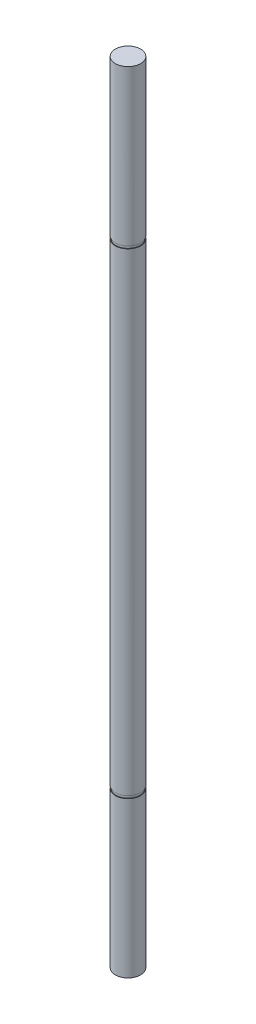
ISO-10303-21;
HEADER;
FILE_DESCRIPTION(('STEP AP214'),'2;1');
FILE_NAME('part.step','',(''),(''),'','','');
FILE_SCHEMA(('AUTOMOTIVE_DESIGN { 1 0 10303 214 1 1 1 1 }'));
ENDSEC;
DATA;
#1=APPLICATION_CONTEXT('core data for automotive mechanical design processes');
#2=APPLICATION_PROTOCOL_DEFINITION('international standard','automotive_design',2000,#1);
#3=PRODUCT_CONTEXT('',#1,'mechanical');
#4=PRODUCT('Part','Part','',(#3));
#5=PRODUCT_RELATED_PRODUCT_CATEGORY('part','',(#4));
#6=PRODUCT_DEFINITION_FORMATION('','',#4);
#7=PRODUCT_DEFINITION_CONTEXT('part definition',#1,'design');
#8=PRODUCT_DEFINITION('design','',#6,#7);
#9=PRODUCT_DEFINITION_SHAPE('','',#8);
#10=(LENGTH_UNIT() NAMED_UNIT(*) SI_UNIT(.MILLI.,.METRE.));
#11=(NAMED_UNIT(*) PLANE_ANGLE_UNIT() SI_UNIT($,.RADIAN.));
#12=(NAMED_UNIT(*) SI_UNIT($,.STERADIAN.) SOLID_ANGLE_UNIT());
#13=UNCERTAINTY_MEASURE_WITH_UNIT(LENGTH_MEASURE(1.E-05),#10,'distance_accuracy_value','');
#14=(GEOMETRIC_REPRESENTATION_CONTEXT(3) GLOBAL_UNCERTAINTY_ASSIGNED_CONTEXT((#13)) GLOBAL_UNIT_ASSIGNED_CONTEXT((#10,
#11,#12)) REPRESENTATION_CONTEXT('',''));
#15=CARTESIAN_POINT('',(0.,0.,0.));
#16=DIRECTION('',(0.,0.,1.));
#17=DIRECTION('',(1.,0.,0.));
#18=AXIS2_PLACEMENT_3D('',#15,#16,#17);
#19=CARTESIAN_POINT('',(0.,125.,0.));
#20=DIRECTION('',(0.,-1.,0.));
#21=DIRECTION('',(0.,0.,-1.));
#22=AXIS2_PLACEMENT_3D('',#19,#20,#21);
#23=CYLINDRICAL_SURFACE('',#22,4.);
#24=CARTESIAN_POINT('',(0.,75.,0.));
#25=DIRECTION('',(0.,1.,0.));
#26=DIRECTION('',(0.,0.,1.));
#27=AXIS2_PLACEMENT_3D('',#24,#25,#26);
#28=CIRCLE('',#27,4.);
#29=CARTESIAN_POINT('',(0.,75.,4.));
#30=VERTEX_POINT('',#29);
#31=EDGE_CURVE('E52',#30,#30,#28,.T.);
#32=ORIENTED_EDGE('',*,*,#31,.F.);
#33=EDGE_LOOP('',(#32));
#34=FACE_BOUND('',#33,.T.);
#35=CARTESIAN_POINT('',(0.,-75.,0.));
#36=DIRECTION('',(0.,-1.,0.));
#37=DIRECTION('',(0.,0.,-1.));
#38=AXIS2_PLACEMENT_3D('',#35,#36,#37);
#39=CIRCLE('',#38,4.);
#40=CARTESIAN_POINT('',(0.,-75.,-4.));
#41=VERTEX_POINT('',#40);
#42=EDGE_CURVE('E56',#41,#41,#39,.T.);
#43=ORIENTED_EDGE('',*,*,#42,.F.);
#44=EDGE_LOOP('',(#43));
#45=FACE_BOUND('',#44,.T.);
#46=ADVANCED_FACE('F33',(#34,#45),#23,.T.);
#47=CARTESIAN_POINT('',(0.,125.,0.));
#48=DIRECTION('',(0.,1.,0.));
#49=DIRECTION('',(0.,0.,1.));
#50=AXIS2_PLACEMENT_3D('',#47,#48,#49);
#51=CIRCLE('',#50,4.);
#52=CARTESIAN_POINT('',(0.,125.,4.));
#53=VERTEX_POINT('',#52);
#54=EDGE_CURVE('E10',#53,#53,#51,.T.);
#55=ORIENTED_EDGE('',*,*,#54,.F.);
#56=EDGE_LOOP('',(#55));
#57=FACE_BOUND('',#56,.T.);
#58=CARTESIAN_POINT('',(0.,75.8,0.));
#59=DIRECTION('',(0.,-1.,0.));
#60=DIRECTION('',(0.,0.,-1.));
#61=AXIS2_PLACEMENT_3D('',#58,#59,#60);
#62=CIRCLE('',#61,4.);
#63=CARTESIAN_POINT('',(0.,75.8,-4.));
#64=VERTEX_POINT('',#63);
#65=EDGE_CURVE('E46',#64,#64,#62,.T.);
#66=ORIENTED_EDGE('',*,*,#65,.F.);
#67=EDGE_LOOP('',(#66));
#68=FACE_BOUND('',#67,.T.);
#69=ADVANCED_FACE('F35',(#57,#68),#23,.T.);
#70=CARTESIAN_POINT('',(0.,125.,0.));
#71=DIRECTION('',(0.,1.,0.));
#72=DIRECTION('',(0.,0.,1.));
#73=AXIS2_PLACEMENT_3D('',#70,#71,#72);
#74=PLANE('',#73);
#75=ORIENTED_EDGE('',*,*,#54,.T.);
#76=EDGE_LOOP('',(#75));
#77=FACE_BOUND('',#76,.T.);
#78=ADVANCED_FACE('F100',(#77),#74,.T.);
#79=CARTESIAN_POINT('',(0.,75.8,-3.79999999999999));
#80=DIRECTION('',(0.,-1.,0.));
#81=DIRECTION('',(0.,0.,-1.));
#82=AXIS2_PLACEMENT_3D('',#79,#80,#81);
#83=PLANE('',#82);
#84=CARTESIAN_POINT('',(0.,75.8,0.));
#85=DIRECTION('',(0.,1.,0.));
#86=DIRECTION('',(0.,0.,1.));
#87=AXIS2_PLACEMENT_3D('',#84,#85,#86);
#88=CIRCLE('',#87,3.79999999999999);
#89=CARTESIAN_POINT('',(0.,75.8,3.79999999999999));
#90=VERTEX_POINT('',#89);
#91=EDGE_CURVE('E49',#90,#90,#88,.T.);
#92=ORIENTED_EDGE('',*,*,#91,.T.);
#93=EDGE_LOOP('',(#92));
#94=FACE_BOUND('',#93,.T.);
#95=ORIENTED_EDGE('',*,*,#65,.T.);
#96=EDGE_LOOP('',(#95));
#97=FACE_BOUND('',#96,.T.);
#98=ADVANCED_FACE('F76',(#94,#97),#83,.T.);
#99=CARTESIAN_POINT('',(0.,75.,-3.79999999999999));
#100=DIRECTION('',(0.,1.,0.));
#101=DIRECTION('',(0.,0.,1.));
#102=AXIS2_PLACEMENT_3D('',#99,#100,#101);
#103=PLANE('',#102);
#104=CARTESIAN_POINT('',(0.,75.,0.));
#105=DIRECTION('',(0.,1.,0.));
#106=DIRECTION('',(0.,0.,1.));
#107=AXIS2_PLACEMENT_3D('',#104,#105,#106);
#108=CIRCLE('',#107,3.79999999999999);
#109=CARTESIAN_POINT('',(0.,75.,3.79999999999999));
#110=VERTEX_POINT('',#109);
#111=EDGE_CURVE('E62',#110,#110,#108,.T.);
#112=ORIENTED_EDGE('',*,*,#111,.F.);
#113=EDGE_LOOP('',(#112));
#114=FACE_BOUND('',#113,.T.);
#115=ORIENTED_EDGE('',*,*,#31,.T.);
#116=EDGE_LOOP('',(#115));
#117=FACE_BOUND('',#116,.T.);
#118=ADVANCED_FACE('F82',(#114,#117),#103,.T.);
#119=CARTESIAN_POINT('',(0.,125.,0.));
#120=DIRECTION('',(0.,1.,0.));
#121=DIRECTION('',(0.,0.,1.));
#122=AXIS2_PLACEMENT_3D('',#119,#120,#121);
#123=CYLINDRICAL_SURFACE('',#122,3.79999999999999);
#124=ORIENTED_EDGE('',*,*,#111,.T.);
#125=EDGE_LOOP('',(#124));
#126=FACE_BOUND('',#125,.T.);
#127=ORIENTED_EDGE('',*,*,#91,.F.);
#128=EDGE_LOOP('',(#127));
#129=FACE_BOUND('',#128,.T.);
#130=ADVANCED_FACE('F79',(#126,#129),#123,.T.);
#131=CARTESIAN_POINT('',(0.,-75.8,-3.79999999999999));
#132=DIRECTION('',(0.,1.,0.));
#133=DIRECTION('',(0.,0.,-1.));
#134=AXIS2_PLACEMENT_3D('',#131,#132,#133);
#135=PLANE('',#134);
#136=CARTESIAN_POINT('',(0.,-75.8,0.));
#137=DIRECTION('',(0.,1.,0.));
#138=DIRECTION('',(0.,0.,1.));
#139=AXIS2_PLACEMENT_3D('',#136,#137,#138);
#140=CIRCLE('',#139,3.79999999999999);
#141=CARTESIAN_POINT('',(0.,-75.8,3.79999999999999));
#142=VERTEX_POINT('',#141);
#143=EDGE_CURVE('E58',#142,#142,#140,.T.);
#144=ORIENTED_EDGE('',*,*,#143,.F.);
#145=EDGE_LOOP('',(#144));
#146=FACE_BOUND('',#145,.T.);
#147=CARTESIAN_POINT('',(0.,-75.8,0.));
#148=DIRECTION('',(0.,1.,0.));
#149=DIRECTION('',(0.,0.,1.));
#150=AXIS2_PLACEMENT_3D('',#147,#148,#149);
#151=CIRCLE('',#150,4.);
#152=CARTESIAN_POINT('',(0.,-75.8,4.));
#153=VERTEX_POINT('',#152);
#154=EDGE_CURVE('E37',#153,#153,#151,.T.);
#155=ORIENTED_EDGE('',*,*,#154,.T.);
#156=EDGE_LOOP('',(#155));
#157=FACE_BOUND('',#156,.T.);
#158=ADVANCED_FACE('F81',(#146,#157),#135,.T.);
#159=CARTESIAN_POINT('',(0.,-75.,-3.79999999999999));
#160=DIRECTION('',(0.,-1.,0.));
#161=DIRECTION('',(0.,0.,1.));
#162=AXIS2_PLACEMENT_3D('',#159,#160,#161);
#163=PLANE('',#162);
#164=CARTESIAN_POINT('',(0.,-75.,0.));
#165=DIRECTION('',(0.,1.,0.));
#166=DIRECTION('',(0.,0.,1.));
#167=AXIS2_PLACEMENT_3D('',#164,#165,#166);
#168=CIRCLE('',#167,3.79999999999999);
#169=CARTESIAN_POINT('',(0.,-75.,3.79999999999999));
#170=VERTEX_POINT('',#169);
#171=EDGE_CURVE('E64',#170,#170,#168,.T.);
#172=ORIENTED_EDGE('',*,*,#171,.T.);
#173=EDGE_LOOP('',(#172));
#174=FACE_BOUND('',#173,.T.);
#175=ORIENTED_EDGE('',*,*,#42,.T.);
#176=EDGE_LOOP('',(#175));
#177=FACE_BOUND('',#176,.T.);
#178=ADVANCED_FACE('F88',(#174,#177),#163,.T.);
#179=CARTESIAN_POINT('',(0.,-125.,0.));
#180=DIRECTION('',(0.,-1.,0.));
#181=DIRECTION('',(0.,0.,1.));
#182=AXIS2_PLACEMENT_3D('',#179,#180,#181);
#183=CYLINDRICAL_SURFACE('',#182,3.79999999999999);
#184=ORIENTED_EDGE('',*,*,#171,.F.);
#185=EDGE_LOOP('',(#184));
#186=FACE_BOUND('',#185,.T.);
#187=ORIENTED_EDGE('',*,*,#143,.T.);
#188=EDGE_LOOP('',(#187));
#189=FACE_BOUND('',#188,.T.);
#190=ADVANCED_FACE('F110',(#186,#189),#183,.T.);
#191=CARTESIAN_POINT('',(0.,-125.,0.));
#192=DIRECTION('',(0.,1.,0.));
#193=DIRECTION('',(0.,0.,1.));
#194=AXIS2_PLACEMENT_3D('',#191,#192,#193);
#195=PLANE('',#194);
#196=CARTESIAN_POINT('',(0.,-125.,0.));
#197=DIRECTION('',(0.,1.,0.));
#198=DIRECTION('',(0.,0.,1.));
#199=AXIS2_PLACEMENT_3D('',#196,#197,#198);
#200=CIRCLE('',#199,4.);
#201=CARTESIAN_POINT('',(0.,-125.,4.));
#202=VERTEX_POINT('',#201);
#203=EDGE_CURVE('E41',#202,#202,#200,.T.);
#204=ORIENTED_EDGE('',*,*,#203,.F.);
#205=EDGE_LOOP('',(#204));
#206=FACE_BOUND('',#205,.T.);
#207=ADVANCED_FACE('F105',(#206),#195,.F.);
#208=ORIENTED_EDGE('',*,*,#203,.T.);
#209=EDGE_LOOP('',(#208));
#210=FACE_BOUND('',#209,.T.);
#211=ORIENTED_EDGE('',*,*,#154,.F.);
#212=EDGE_LOOP('',(#211));
#213=FACE_BOUND('',#212,.T.);
#214=ADVANCED_FACE('F96',(#210,#213),#23,.T.);
#215=CLOSED_SHELL('',(#46,#69,#78,#98,#118,#130,#158,#178,#190,#207,#214));
#216=MANIFOLD_SOLID_BREP('B2',#215);
#217=ADVANCED_BREP_SHAPE_REPRESENTATION('',(#18,#216),#14);
#218=SHAPE_DEFINITION_REPRESENTATION(#9,#217);
ENDSEC;
END-ISO-10303-21;
